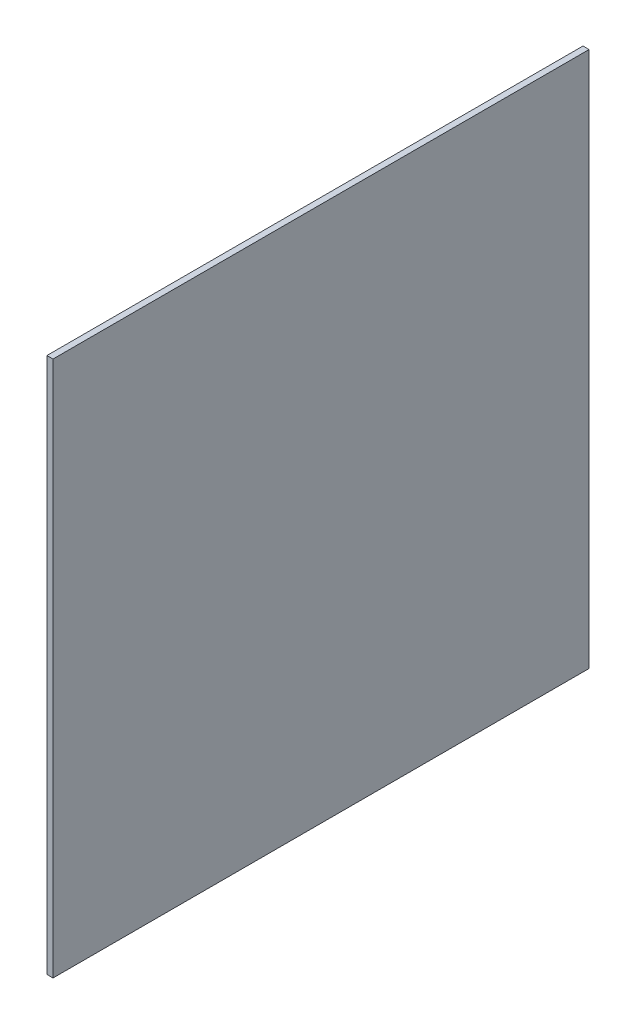
ISO-10303-21;
HEADER;
FILE_DESCRIPTION(('STEP AP214'),'2;1');
FILE_NAME('part.step','',(''),(''),'','','');
FILE_SCHEMA(('AUTOMOTIVE_DESIGN { 1 0 10303 214 1 1 1 1 }'));
ENDSEC;
DATA;
#1=APPLICATION_CONTEXT('core data for automotive mechanical design processes');
#2=APPLICATION_PROTOCOL_DEFINITION('international standard','automotive_design',2000,#1);
#3=PRODUCT_CONTEXT('',#1,'mechanical');
#4=PRODUCT('Part','Part','',(#3));
#5=PRODUCT_RELATED_PRODUCT_CATEGORY('part','',(#4));
#6=PRODUCT_DEFINITION_FORMATION('','',#4);
#7=PRODUCT_DEFINITION_CONTEXT('part definition',#1,'design');
#8=PRODUCT_DEFINITION('design','',#6,#7);
#9=PRODUCT_DEFINITION_SHAPE('','',#8);
#10=(LENGTH_UNIT() NAMED_UNIT(*) SI_UNIT(.MILLI.,.METRE.));
#11=(NAMED_UNIT(*) PLANE_ANGLE_UNIT() SI_UNIT($,.RADIAN.));
#12=(NAMED_UNIT(*) SI_UNIT($,.STERADIAN.) SOLID_ANGLE_UNIT());
#13=UNCERTAINTY_MEASURE_WITH_UNIT(LENGTH_MEASURE(1.E-05),#10,'distance_accuracy_value','');
#14=(GEOMETRIC_REPRESENTATION_CONTEXT(3) GLOBAL_UNCERTAINTY_ASSIGNED_CONTEXT((#13)) GLOBAL_UNIT_ASSIGNED_CONTEXT((#10,
#11,#12)) REPRESENTATION_CONTEXT('',''));
#15=CARTESIAN_POINT('',(0.,0.,0.));
#16=DIRECTION('',(0.,0.,1.));
#17=DIRECTION('',(1.,0.,0.));
#18=AXIS2_PLACEMENT_3D('',#15,#16,#17);
#19=CARTESIAN_POINT('',(1.5875,0.,0.));
#20=DIRECTION('',(0.,0.,-1.));
#21=DIRECTION('',(-1.,0.,0.));
#22=AXIS2_PLACEMENT_3D('',#19,#20,#21);
#23=PLANE('',#22);
#24=DIRECTION('',(0.,-1.,0.));
#25=VECTOR('',#24,1.);
#26=CARTESIAN_POINT('',(0.,0.,0.));
#27=LINE('',#26,#25);
#28=CARTESIAN_POINT('',(0.,139.7,0.));
#29=VERTEX_POINT('',#28);
#30=CARTESIAN_POINT('',(0.,0.,0.));
#31=VERTEX_POINT('',#30);
#32=EDGE_CURVE('E96',#29,#31,#27,.T.);
#33=ORIENTED_EDGE('',*,*,#32,.T.);
#34=DIRECTION('',(-1.,0.,0.));
#35=VECTOR('',#34,1.);
#36=CARTESIAN_POINT('',(1.5875,0.,0.));
#37=LINE('',#36,#35);
#38=CARTESIAN_POINT('',(1.5875,0.,0.));
#39=VERTEX_POINT('',#38);
#40=EDGE_CURVE('E11',#39,#31,#37,.T.);
#41=ORIENTED_EDGE('',*,*,#40,.F.);
#42=DIRECTION('',(0.,-1.,0.));
#43=VECTOR('',#42,1.);
#44=CARTESIAN_POINT('',(1.5875,0.,0.));
#45=LINE('',#44,#43);
#46=CARTESIAN_POINT('',(1.5875,139.7,0.));
#47=VERTEX_POINT('',#46);
#48=EDGE_CURVE('E84',#47,#39,#45,.T.);
#49=ORIENTED_EDGE('',*,*,#48,.F.);
#50=DIRECTION('',(-1.,0.,0.));
#51=VECTOR('',#50,1.);
#52=CARTESIAN_POINT('',(1.5875,139.7,0.));
#53=LINE('',#52,#51);
#54=EDGE_CURVE('E92',#47,#29,#53,.T.);
#55=ORIENTED_EDGE('',*,*,#54,.T.);
#56=EDGE_LOOP('',(#33,#41,#49,#55));
#57=FACE_BOUND('',#56,.T.);
#58=ADVANCED_FACE('F33',(#57),#23,.F.);
#59=CARTESIAN_POINT('',(1.5875,0.,0.));
#60=DIRECTION('',(0.,1.,0.));
#61=DIRECTION('',(0.,0.,1.));
#62=AXIS2_PLACEMENT_3D('',#59,#60,#61);
#63=PLANE('',#62);
#64=DIRECTION('',(0.,0.,-1.));
#65=VECTOR('',#64,1.);
#66=CARTESIAN_POINT('',(0.,0.,0.));
#67=LINE('',#66,#65);
#68=CARTESIAN_POINT('',(0.,0.,-139.7));
#69=VERTEX_POINT('',#68);
#70=EDGE_CURVE('E88',#31,#69,#67,.T.);
#71=ORIENTED_EDGE('',*,*,#70,.T.);
#72=DIRECTION('',(-1.,0.,0.));
#73=VECTOR('',#72,1.);
#74=CARTESIAN_POINT('',(1.5875,0.,-139.7));
#75=LINE('',#74,#73);
#76=CARTESIAN_POINT('',(1.5875,0.,-139.7));
#77=VERTEX_POINT('',#76);
#78=EDGE_CURVE('E41',#77,#69,#75,.T.);
#79=ORIENTED_EDGE('',*,*,#78,.F.);
#80=DIRECTION('',(0.,0.,-1.));
#81=VECTOR('',#80,1.);
#82=CARTESIAN_POINT('',(1.5875,0.,0.));
#83=LINE('',#82,#81);
#84=EDGE_CURVE('E79',#39,#77,#83,.T.);
#85=ORIENTED_EDGE('',*,*,#84,.F.);
#86=ORIENTED_EDGE('',*,*,#40,.T.);
#87=EDGE_LOOP('',(#71,#79,#85,#86));
#88=FACE_BOUND('',#87,.T.);
#89=ADVANCED_FACE('F87',(#88),#63,.F.);
#90=CARTESIAN_POINT('',(1.5875,0.,-139.7));
#91=DIRECTION('',(0.,0.,1.));
#92=DIRECTION('',(1.,0.,0.));
#93=AXIS2_PLACEMENT_3D('',#90,#91,#92);
#94=PLANE('',#93);
#95=DIRECTION('',(0.,1.,0.));
#96=VECTOR('',#95,1.);
#97=CARTESIAN_POINT('',(0.,0.,-139.7));
#98=LINE('',#97,#96);
#99=CARTESIAN_POINT('',(0.,139.7,-139.7));
#100=VERTEX_POINT('',#99);
#101=EDGE_CURVE('E66',#69,#100,#98,.T.);
#102=ORIENTED_EDGE('',*,*,#101,.T.);
#103=DIRECTION('',(-1.,0.,0.));
#104=VECTOR('',#103,1.);
#105=CARTESIAN_POINT('',(1.5875,139.7,-139.7));
#106=LINE('',#105,#104);
#107=CARTESIAN_POINT('',(1.5875,139.7,-139.7));
#108=VERTEX_POINT('',#107);
#109=EDGE_CURVE('E89',#108,#100,#106,.T.);
#110=ORIENTED_EDGE('',*,*,#109,.F.);
#111=DIRECTION('',(0.,1.,0.));
#112=VECTOR('',#111,1.);
#113=CARTESIAN_POINT('',(1.5875,0.,-139.7));
#114=LINE('',#113,#112);
#115=EDGE_CURVE('E82',#77,#108,#114,.T.);
#116=ORIENTED_EDGE('',*,*,#115,.F.);
#117=ORIENTED_EDGE('',*,*,#78,.T.);
#118=EDGE_LOOP('',(#102,#110,#116,#117));
#119=FACE_BOUND('',#118,.T.);
#120=ADVANCED_FACE('F90',(#119),#94,.F.);
#121=CARTESIAN_POINT('',(1.5875,139.7,0.));
#122=DIRECTION('',(0.,-1.,0.));
#123=DIRECTION('',(0.,0.,-1.));
#124=AXIS2_PLACEMENT_3D('',#121,#122,#123);
#125=PLANE('',#124);
#126=DIRECTION('',(0.,0.,1.));
#127=VECTOR('',#126,1.);
#128=CARTESIAN_POINT('',(0.,139.7,0.));
#129=LINE('',#128,#127);
#130=EDGE_CURVE('E72',#100,#29,#129,.T.);
#131=ORIENTED_EDGE('',*,*,#130,.T.);
#132=ORIENTED_EDGE('',*,*,#54,.F.);
#133=DIRECTION('',(0.,0.,1.));
#134=VECTOR('',#133,1.);
#135=CARTESIAN_POINT('',(1.5875,139.7,0.));
#136=LINE('',#135,#134);
#137=EDGE_CURVE('E49',#108,#47,#136,.T.);
#138=ORIENTED_EDGE('',*,*,#137,.F.);
#139=ORIENTED_EDGE('',*,*,#109,.T.);
#140=EDGE_LOOP('',(#131,#132,#138,#139));
#141=FACE_BOUND('',#140,.T.);
#142=ADVANCED_FACE('F103',(#141),#125,.F.);
#143=CARTESIAN_POINT('',(1.5875,0.,0.));
#144=DIRECTION('',(-1.,0.,0.));
#145=DIRECTION('',(0.,0.,1.));
#146=AXIS2_PLACEMENT_3D('',#143,#144,#145);
#147=PLANE('',#146);
#148=ORIENTED_EDGE('',*,*,#48,.T.);
#149=ORIENTED_EDGE('',*,*,#84,.T.);
#150=ORIENTED_EDGE('',*,*,#115,.T.);
#151=ORIENTED_EDGE('',*,*,#137,.T.);
#152=EDGE_LOOP('',(#148,#149,#150,#151));
#153=FACE_BOUND('',#152,.T.);
#154=ADVANCED_FACE('F80',(#153),#147,.F.);
#155=CARTESIAN_POINT('',(0.,0.,0.));
#156=DIRECTION('',(-1.,0.,0.));
#157=DIRECTION('',(0.,0.,1.));
#158=AXIS2_PLACEMENT_3D('',#155,#156,#157);
#159=PLANE('',#158);
#160=ORIENTED_EDGE('',*,*,#32,.F.);
#161=ORIENTED_EDGE('',*,*,#130,.F.);
#162=ORIENTED_EDGE('',*,*,#101,.F.);
#163=ORIENTED_EDGE('',*,*,#70,.F.);
#164=EDGE_LOOP('',(#160,#161,#162,#163));
#165=FACE_BOUND('',#164,.T.);
#166=ADVANCED_FACE('F106',(#165),#159,.T.);
#167=CLOSED_SHELL('',(#58,#89,#120,#142,#154,#166));
#168=MANIFOLD_SOLID_BREP('B2',#167);
#169=ADVANCED_BREP_SHAPE_REPRESENTATION('',(#18,#168),#14);
#170=SHAPE_DEFINITION_REPRESENTATION(#9,#169);
ENDSEC;
END-ISO-10303-21;
